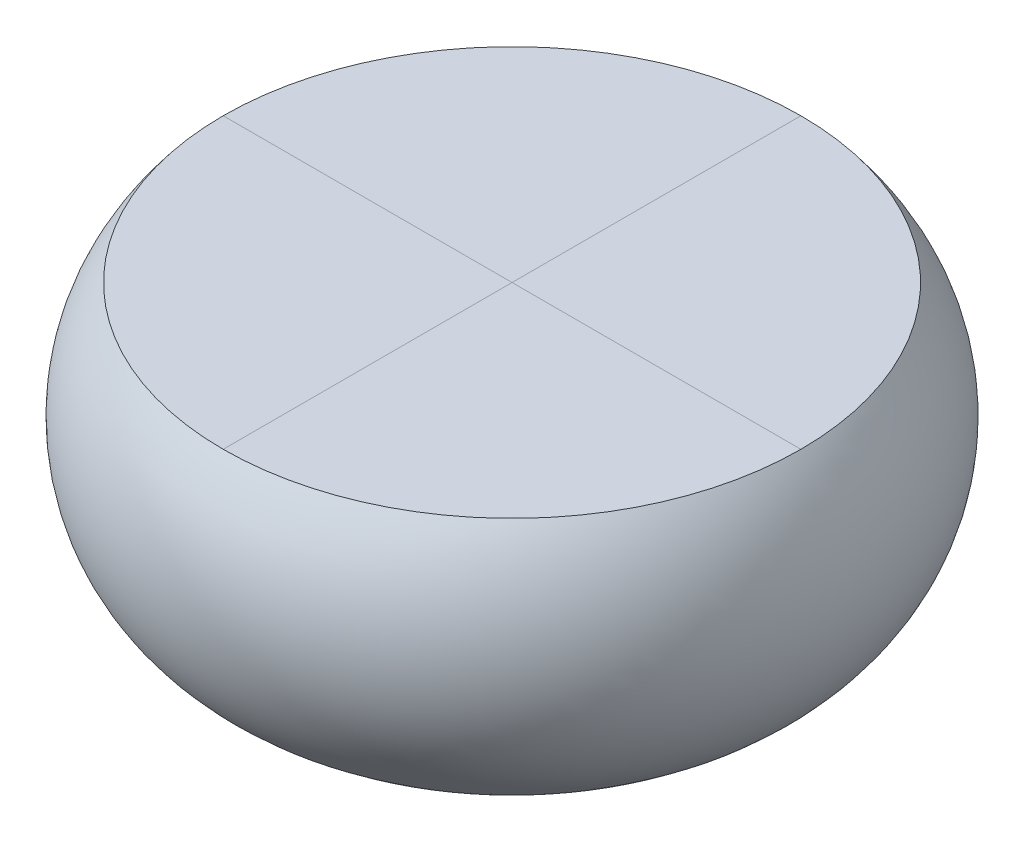
ISO-10303-21;
HEADER;
FILE_DESCRIPTION(('STEP AP214'),'2;1');
FILE_NAME('part.step','',(''),(''),'','','');
FILE_SCHEMA(('AUTOMOTIVE_DESIGN { 1 0 10303 214 1 1 1 1 }'));
ENDSEC;
DATA;
#1=APPLICATION_CONTEXT('core data for automotive mechanical design processes');
#2=APPLICATION_PROTOCOL_DEFINITION('international standard','automotive_design',2000,#1);
#3=PRODUCT_CONTEXT('',#1,'mechanical');
#4=PRODUCT('Part','Part','',(#3));
#5=PRODUCT_RELATED_PRODUCT_CATEGORY('part','',(#4));
#6=PRODUCT_DEFINITION_FORMATION('','',#4);
#7=PRODUCT_DEFINITION_CONTEXT('part definition',#1,'design');
#8=PRODUCT_DEFINITION('design','',#6,#7);
#9=PRODUCT_DEFINITION_SHAPE('','',#8);
#10=(LENGTH_UNIT() NAMED_UNIT(*) SI_UNIT(.MILLI.,.METRE.));
#11=(NAMED_UNIT(*) PLANE_ANGLE_UNIT() SI_UNIT($,.RADIAN.));
#12=(NAMED_UNIT(*) SI_UNIT($,.STERADIAN.) SOLID_ANGLE_UNIT());
#13=UNCERTAINTY_MEASURE_WITH_UNIT(LENGTH_MEASURE(1.E-05),#10,'distance_accuracy_value','');
#14=(GEOMETRIC_REPRESENTATION_CONTEXT(3) GLOBAL_UNCERTAINTY_ASSIGNED_CONTEXT((#13)) GLOBAL_UNIT_ASSIGNED_CONTEXT((#10,
#11,#12)) REPRESENTATION_CONTEXT('',''));
#15=CARTESIAN_POINT('',(0.,0.,0.));
#16=DIRECTION('',(0.,0.,1.));
#17=DIRECTION('',(1.,0.,0.));
#18=AXIS2_PLACEMENT_3D('',#15,#16,#17);
#19=CARTESIAN_POINT('',(115.350199906915,118.59409895004,0.));
#20=DIRECTION('',(0.,-1.,0.));
#21=DIRECTION('',(0.,0.,-1.));
#22=AXIS2_PLACEMENT_3D('',#19,#20,#21);
#23=PLANE('',#22);
#24=DIRECTION('',(-1.,0.,0.));
#25=VECTOR('',#24,1.);
#26=CARTESIAN_POINT('',(115.350199906915,118.59409895004,0.));
#27=LINE('',#26,#25);
#28=CARTESIAN_POINT('',(0.,118.59409895004,0.));
#29=VERTEX_POINT('',#28);
#30=CARTESIAN_POINT('',(-115.350199906915,118.59409895004,0.));
#31=VERTEX_POINT('',#30);
#32=EDGE_CURVE('E11',#29,#31,#27,.T.);
#33=ORIENTED_EDGE('',*,*,#32,.F.);
#34=DIRECTION('',(0.,0.,-1.));
#35=VECTOR('',#34,1.);
#36=CARTESIAN_POINT('',(0.,118.59409895004,0.));
#37=LINE('',#36,#35);
#38=CARTESIAN_POINT('',(0.,118.59409895004,-115.350199906915));
#39=VERTEX_POINT('',#38);
#40=EDGE_CURVE('E80',#29,#39,#37,.T.);
#41=ORIENTED_EDGE('',*,*,#40,.T.);
#42=CARTESIAN_POINT('',(0.,118.59409895004,0.));
#43=DIRECTION('',(0.,1.,0.));
#44=DIRECTION('',(0.,0.,1.));
#45=AXIS2_PLACEMENT_3D('',#42,#43,#44);
#46=CIRCLE('',#45,115.350199906915);
#47=EDGE_CURVE('E71',#39,#31,#46,.T.);
#48=ORIENTED_EDGE('',*,*,#47,.T.);
#49=EDGE_LOOP('',(#33,#41,#48));
#50=FACE_BOUND('',#49,.T.);
#51=ADVANCED_FACE('F35',(#50),#23,.F.);
#52=DIRECTION('',(-1.,0.,0.));
#53=VECTOR('',#52,1.);
#54=CARTESIAN_POINT('',(115.350199906915,118.59409895004,0.));
#55=LINE('',#54,#53);
#56=CARTESIAN_POINT('',(115.350199906915,118.59409895004,0.));
#57=VERTEX_POINT('',#56);
#58=EDGE_CURVE('E39',#57,#29,#55,.T.);
#59=ORIENTED_EDGE('',*,*,#58,.F.);
#60=EDGE_CURVE('E74',#57,#39,#46,.T.);
#61=ORIENTED_EDGE('',*,*,#60,.T.);
#62=ORIENTED_EDGE('',*,*,#40,.F.);
#63=EDGE_LOOP('',(#59,#61,#62));
#64=FACE_BOUND('',#63,.T.);
#65=ADVANCED_FACE('F87',(#64),#23,.F.);
#66=CARTESIAN_POINT('',(0.,118.59409895004,115.350199906915));
#67=VERTEX_POINT('',#66);
#68=EDGE_CURVE('E75',#67,#57,#46,.T.);
#69=ORIENTED_EDGE('',*,*,#68,.T.);
#70=ORIENTED_EDGE('',*,*,#58,.T.);
#71=EDGE_CURVE('E66',#67,#29,#37,.T.);
#72=ORIENTED_EDGE('',*,*,#71,.F.);
#73=EDGE_LOOP('',(#69,#70,#72));
#74=FACE_BOUND('',#73,.T.);
#75=ADVANCED_FACE('F78',(#74),#23,.F.);
#76=CARTESIAN_POINT('',(0.,72.4523717981406,0.));
#77=DIRECTION('',(0.,1.,0.));
#78=DIRECTION('',(0.,0.,1.));
#79=AXIS2_PLACEMENT_3D('',#76,#77,#78);
#80=DEGENERATE_TOROIDAL_SURFACE('',#79,58.0136,73.597178434,.T.);
#81=ORIENTED_EDGE('',*,*,#68,.F.);
#82=EDGE_CURVE('E63',#31,#67,#46,.T.);
#83=ORIENTED_EDGE('',*,*,#82,.F.);
#84=ORIENTED_EDGE('',*,*,#47,.F.);
#85=ORIENTED_EDGE('',*,*,#60,.F.);
#86=EDGE_LOOP('',(#81,#83,#84,#85));
#87=FACE_BOUND('',#86,.T.);
#88=CARTESIAN_POINT('',(0.,0.,0.));
#89=DIRECTION('',(0.,1.,0.));
#90=DIRECTION('',(0.,0.,1.));
#91=AXIS2_PLACEMENT_3D('',#88,#89,#90);
#92=CIRCLE('',#91,70.9441256764769);
#93=CARTESIAN_POINT('',(0.,0.,70.9441256764769));
#94=VERTEX_POINT('',#93);
#95=EDGE_CURVE('E72',#94,#94,#92,.T.);
#96=ORIENTED_EDGE('',*,*,#95,.T.);
#97=EDGE_LOOP('',(#96));
#98=FACE_BOUND('',#97,.T.);
#99=ADVANCED_FACE('F37',(#87,#98),#80,.T.);
#100=ORIENTED_EDGE('',*,*,#71,.T.);
#101=ORIENTED_EDGE('',*,*,#32,.T.);
#102=ORIENTED_EDGE('',*,*,#82,.T.);
#103=EDGE_LOOP('',(#100,#101,#102));
#104=FACE_BOUND('',#103,.T.);
#105=ADVANCED_FACE('F65',(#104),#23,.F.);
#106=CARTESIAN_POINT('',(0.,0.,0.));
#107=DIRECTION('',(0.,1.,0.));
#108=DIRECTION('',(0.,0.,1.));
#109=AXIS2_PLACEMENT_3D('',#106,#107,#108);
#110=PLANE('',#109);
#111=ORIENTED_EDGE('',*,*,#95,.F.);
#112=EDGE_LOOP('',(#111));
#113=FACE_BOUND('',#112,.T.);
#114=ADVANCED_FACE('F95',(#113),#110,.F.);
#115=CLOSED_SHELL('',(#51,#65,#75,#99,#105,#114));
#116=MANIFOLD_SOLID_BREP('B2',#115);
#117=ADVANCED_BREP_SHAPE_REPRESENTATION('',(#18,#116),#14);
#118=SHAPE_DEFINITION_REPRESENTATION(#9,#117);
ENDSEC;
END-ISO-10303-21;
